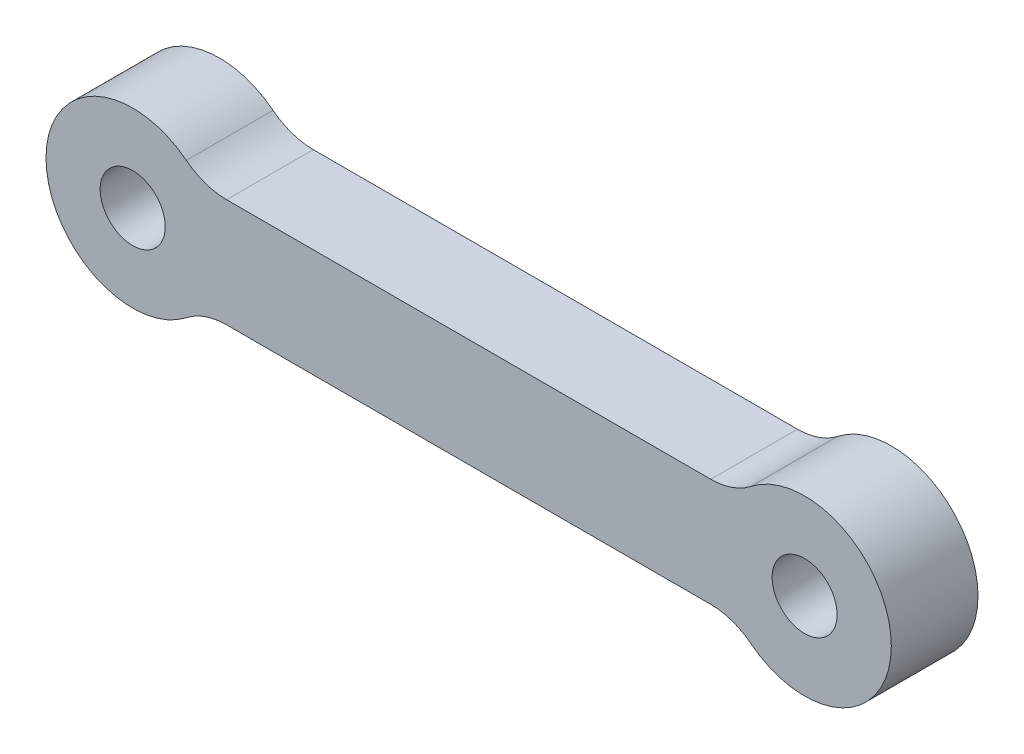
ISO-10303-21;
HEADER;
FILE_DESCRIPTION(('STEP AP214'),'2;1');
FILE_NAME('part.step','',(''),(''),'','','');
FILE_SCHEMA(('AUTOMOTIVE_DESIGN { 1 0 10303 214 1 1 1 1 }'));
ENDSEC;
DATA;
#1=APPLICATION_CONTEXT('core data for automotive mechanical design processes');
#2=APPLICATION_PROTOCOL_DEFINITION('international standard','automotive_design',2000,#1);
#3=PRODUCT_CONTEXT('',#1,'mechanical');
#4=PRODUCT('Part','Part','',(#3));
#5=PRODUCT_RELATED_PRODUCT_CATEGORY('part','',(#4));
#6=PRODUCT_DEFINITION_FORMATION('','',#4);
#7=PRODUCT_DEFINITION_CONTEXT('part definition',#1,'design');
#8=PRODUCT_DEFINITION('design','',#6,#7);
#9=PRODUCT_DEFINITION_SHAPE('','',#8);
#10=(LENGTH_UNIT() NAMED_UNIT(*) SI_UNIT(.MILLI.,.METRE.));
#11=(NAMED_UNIT(*) PLANE_ANGLE_UNIT() SI_UNIT($,.RADIAN.));
#12=(NAMED_UNIT(*) SI_UNIT($,.STERADIAN.) SOLID_ANGLE_UNIT());
#13=UNCERTAINTY_MEASURE_WITH_UNIT(LENGTH_MEASURE(1.E-05),#10,'distance_accuracy_value','');
#14=(GEOMETRIC_REPRESENTATION_CONTEXT(3) GLOBAL_UNCERTAINTY_ASSIGNED_CONTEXT((#13)) GLOBAL_UNIT_ASSIGNED_CONTEXT((#10,
#11,#12)) REPRESENTATION_CONTEXT('',''));
#15=CARTESIAN_POINT('',(0.,0.,0.));
#16=DIRECTION('',(0.,0.,1.));
#17=DIRECTION('',(1.,0.,0.));
#18=AXIS2_PLACEMENT_3D('',#15,#16,#17);
#19=CARTESIAN_POINT('',(11.1698729810778,-5.5,4.));
#20=DIRECTION('',(0.,0.,-1.));
#21=DIRECTION('',(-1.,0.,0.));
#22=AXIS2_PLACEMENT_3D('',#19,#20,#21);
#23=PLANE('',#22);
#24=CARTESIAN_POINT('',(11.1698729810778,-5.5,4.));
#25=DIRECTION('',(0.,0.,-1.));
#26=DIRECTION('',(-1.,0.,0.));
#27=AXIS2_PLACEMENT_3D('',#24,#25,#26);
#28=CIRCLE('',#27,3.);
#29=CARTESIAN_POINT('',(11.1698729810778,-2.5,4.));
#30=VERTEX_POINT('',#29);
#31=CARTESIAN_POINT('',(13.025641703473,-3.14285714285714,4.));
#32=VERTEX_POINT('',#31);
#33=EDGE_CURVE('E155',#30,#32,#28,.T.);
#34=ORIENTED_EDGE('',*,*,#33,.T.);
#35=CARTESIAN_POINT('',(15.5,0.,4.));
#36=DIRECTION('',(0.,0.,1.));
#37=DIRECTION('',(-1.,0.,0.));
#38=AXIS2_PLACEMENT_3D('',#35,#36,#37);
#39=CIRCLE('',#38,4.);
#40=CARTESIAN_POINT('',(13.025641703473,3.14285714285714,4.));
#41=VERTEX_POINT('',#40);
#42=EDGE_CURVE('E104',#32,#41,#39,.T.);
#43=ORIENTED_EDGE('',*,*,#42,.T.);
#44=CARTESIAN_POINT('',(11.1698729810778,5.5,4.));
#45=DIRECTION('',(0.,0.,-1.));
#46=DIRECTION('',(1.,0.,0.));
#47=AXIS2_PLACEMENT_3D('',#44,#45,#46);
#48=CIRCLE('',#47,3.);
#49=CARTESIAN_POINT('',(11.1698729810778,2.5,4.));
#50=VERTEX_POINT('',#49);
#51=EDGE_CURVE('E169',#41,#50,#48,.T.);
#52=ORIENTED_EDGE('',*,*,#51,.T.);
#53=DIRECTION('',(-1.,0.,0.));
#54=VECTOR('',#53,1.);
#55=CARTESIAN_POINT('',(-11.1698729810778,2.5,4.));
#56=LINE('',#55,#54);
#57=CARTESIAN_POINT('',(-11.1698729810778,2.5,4.));
#58=VERTEX_POINT('',#57);
#59=EDGE_CURVE('E183',#50,#58,#56,.T.);
#60=ORIENTED_EDGE('',*,*,#59,.T.);
#61=CARTESIAN_POINT('',(-11.1698729810778,5.5,4.));
#62=DIRECTION('',(0.,0.,-1.));
#63=DIRECTION('',(-1.,0.,0.));
#64=AXIS2_PLACEMENT_3D('',#61,#62,#63);
#65=CIRCLE('',#64,3.);
#66=CARTESIAN_POINT('',(-13.025641703473,3.14285714285714,4.));
#67=VERTEX_POINT('',#66);
#68=EDGE_CURVE('E122',#58,#67,#65,.T.);
#69=ORIENTED_EDGE('',*,*,#68,.T.);
#70=CARTESIAN_POINT('',(-15.5,0.,4.));
#71=DIRECTION('',(0.,0.,1.));
#72=DIRECTION('',(1.,0.,0.));
#73=AXIS2_PLACEMENT_3D('',#70,#71,#72);
#74=CIRCLE('',#73,4.);
#75=CARTESIAN_POINT('',(-13.025641703473,-3.14285714285714,4.));
#76=VERTEX_POINT('',#75);
#77=EDGE_CURVE('E116',#67,#76,#74,.T.);
#78=ORIENTED_EDGE('',*,*,#77,.T.);
#79=CARTESIAN_POINT('',(-11.1698729810778,-5.5,4.));
#80=DIRECTION('',(0.,0.,-1.));
#81=DIRECTION('',(-1.,0.,0.));
#82=AXIS2_PLACEMENT_3D('',#79,#80,#81);
#83=CIRCLE('',#82,3.);
#84=CARTESIAN_POINT('',(-11.1698729810778,-2.5,4.));
#85=VERTEX_POINT('',#84);
#86=EDGE_CURVE('E120',#76,#85,#83,.T.);
#87=ORIENTED_EDGE('',*,*,#86,.T.);
#88=DIRECTION('',(1.,0.,0.));
#89=VECTOR('',#88,1.);
#90=CARTESIAN_POINT('',(-11.1698729810778,-2.5,4.));
#91=LINE('',#90,#89);
#92=EDGE_CURVE('E58',#85,#30,#91,.T.);
#93=ORIENTED_EDGE('',*,*,#92,.T.);
#94=EDGE_LOOP('',(#34,#43,#52,#60,#69,#78,#87,#93));
#95=FACE_BOUND('',#94,.T.);
#96=CARTESIAN_POINT('',(-15.5,0.,4.));
#97=DIRECTION('',(0.,0.,1.));
#98=DIRECTION('',(1.,0.,0.));
#99=AXIS2_PLACEMENT_3D('',#96,#97,#98);
#100=CIRCLE('',#99,1.5);
#101=CARTESIAN_POINT('',(-14.,0.,4.));
#102=VERTEX_POINT('',#101);
#103=EDGE_CURVE('E143',#102,#102,#100,.T.);
#104=ORIENTED_EDGE('',*,*,#103,.F.);
#105=EDGE_LOOP('',(#104));
#106=FACE_BOUND('',#105,.T.);
#107=CARTESIAN_POINT('',(15.5,0.,4.));
#108=DIRECTION('',(0.,0.,1.));
#109=DIRECTION('',(-1.,0.,0.));
#110=AXIS2_PLACEMENT_3D('',#107,#108,#109);
#111=CIRCLE('',#110,1.5);
#112=CARTESIAN_POINT('',(14.,0.,4.));
#113=VERTEX_POINT('',#112);
#114=EDGE_CURVE('E195',#113,#113,#111,.T.);
#115=ORIENTED_EDGE('',*,*,#114,.F.);
#116=EDGE_LOOP('',(#115));
#117=FACE_BOUND('',#116,.T.);
#118=ADVANCED_FACE('F43',(#95,#106,#117),#23,.F.);
#119=CARTESIAN_POINT('',(11.1698729810778,-5.5,0.));
#120=DIRECTION('',(0.,0.,-1.));
#121=DIRECTION('',(-1.,0.,0.));
#122=AXIS2_PLACEMENT_3D('',#119,#120,#121);
#123=PLANE('',#122);
#124=CARTESIAN_POINT('',(-15.5,0.,0.));
#125=DIRECTION('',(0.,0.,1.));
#126=DIRECTION('',(1.,0.,0.));
#127=AXIS2_PLACEMENT_3D('',#124,#125,#126);
#128=CIRCLE('',#127,1.5);
#129=CARTESIAN_POINT('',(-14.,0.,0.));
#130=VERTEX_POINT('',#129);
#131=EDGE_CURVE('E188',#130,#130,#128,.T.);
#132=ORIENTED_EDGE('',*,*,#131,.T.);
#133=EDGE_LOOP('',(#132));
#134=FACE_BOUND('',#133,.T.);
#135=CARTESIAN_POINT('',(11.1698729810778,-5.5,0.));
#136=DIRECTION('',(0.,0.,-1.));
#137=DIRECTION('',(-1.,0.,0.));
#138=AXIS2_PLACEMENT_3D('',#135,#136,#137);
#139=CIRCLE('',#138,3.);
#140=CARTESIAN_POINT('',(11.1698729810778,-2.5,0.));
#141=VERTEX_POINT('',#140);
#142=CARTESIAN_POINT('',(13.025641703473,-3.14285714285714,0.));
#143=VERTEX_POINT('',#142);
#144=EDGE_CURVE('E139',#141,#143,#139,.T.);
#145=ORIENTED_EDGE('',*,*,#144,.F.);
#146=DIRECTION('',(1.,0.,0.));
#147=VECTOR('',#146,1.);
#148=CARTESIAN_POINT('',(-11.1698729810778,-2.5,0.));
#149=LINE('',#148,#147);
#150=CARTESIAN_POINT('',(-11.1698729810778,-2.5,0.));
#151=VERTEX_POINT('',#150);
#152=EDGE_CURVE('E94',#151,#141,#149,.T.);
#153=ORIENTED_EDGE('',*,*,#152,.F.);
#154=CARTESIAN_POINT('',(-11.1698729810778,-5.5,0.));
#155=DIRECTION('',(0.,0.,-1.));
#156=DIRECTION('',(-1.,0.,0.));
#157=AXIS2_PLACEMENT_3D('',#154,#155,#156);
#158=CIRCLE('',#157,3.);
#159=CARTESIAN_POINT('',(-13.025641703473,-3.14285714285714,0.));
#160=VERTEX_POINT('',#159);
#161=EDGE_CURVE('E87',#160,#151,#158,.T.);
#162=ORIENTED_EDGE('',*,*,#161,.F.);
#163=CARTESIAN_POINT('',(-15.5,0.,0.));
#164=DIRECTION('',(0.,0.,1.));
#165=DIRECTION('',(1.,0.,0.));
#166=AXIS2_PLACEMENT_3D('',#163,#164,#165);
#167=CIRCLE('',#166,4.);
#168=CARTESIAN_POINT('',(-13.025641703473,3.14285714285714,0.));
#169=VERTEX_POINT('',#168);
#170=EDGE_CURVE('E127',#169,#160,#167,.T.);
#171=ORIENTED_EDGE('',*,*,#170,.F.);
#172=CARTESIAN_POINT('',(-11.1698729810778,5.5,0.));
#173=DIRECTION('',(0.,0.,-1.));
#174=DIRECTION('',(-1.,0.,0.));
#175=AXIS2_PLACEMENT_3D('',#172,#173,#174);
#176=CIRCLE('',#175,3.);
#177=CARTESIAN_POINT('',(-11.1698729810778,2.5,0.));
#178=VERTEX_POINT('',#177);
#179=EDGE_CURVE('E148',#178,#169,#176,.T.);
#180=ORIENTED_EDGE('',*,*,#179,.F.);
#181=DIRECTION('',(-1.,0.,0.));
#182=VECTOR('',#181,1.);
#183=CARTESIAN_POINT('',(-11.1698729810778,2.5,0.));
#184=LINE('',#183,#182);
#185=CARTESIAN_POINT('',(11.1698729810778,2.5,0.));
#186=VERTEX_POINT('',#185);
#187=EDGE_CURVE('E149',#186,#178,#184,.T.);
#188=ORIENTED_EDGE('',*,*,#187,.F.);
#189=CARTESIAN_POINT('',(11.1698729810778,5.5,0.));
#190=DIRECTION('',(0.,0.,-1.));
#191=DIRECTION('',(1.,0.,0.));
#192=AXIS2_PLACEMENT_3D('',#189,#190,#191);
#193=CIRCLE('',#192,3.);
#194=CARTESIAN_POINT('',(13.025641703473,3.14285714285714,0.));
#195=VERTEX_POINT('',#194);
#196=EDGE_CURVE('E147',#195,#186,#193,.T.);
#197=ORIENTED_EDGE('',*,*,#196,.F.);
#198=CARTESIAN_POINT('',(15.5,0.,0.));
#199=DIRECTION('',(0.,0.,1.));
#200=DIRECTION('',(-1.,0.,0.));
#201=AXIS2_PLACEMENT_3D('',#198,#199,#200);
#202=CIRCLE('',#201,4.);
#203=EDGE_CURVE('E142',#143,#195,#202,.T.);
#204=ORIENTED_EDGE('',*,*,#203,.F.);
#205=EDGE_LOOP('',(#145,#153,#162,#171,#180,#188,#197,#204));
#206=FACE_BOUND('',#205,.T.);
#207=CARTESIAN_POINT('',(15.5,0.,0.));
#208=DIRECTION('',(0.,0.,1.));
#209=DIRECTION('',(-1.,0.,0.));
#210=AXIS2_PLACEMENT_3D('',#207,#208,#209);
#211=CIRCLE('',#210,1.5);
#212=CARTESIAN_POINT('',(14.,0.,0.));
#213=VERTEX_POINT('',#212);
#214=EDGE_CURVE('E193',#213,#213,#211,.T.);
#215=ORIENTED_EDGE('',*,*,#214,.T.);
#216=EDGE_LOOP('',(#215));
#217=FACE_BOUND('',#216,.T.);
#218=ADVANCED_FACE('F174',(#134,#206,#217),#123,.T.);
#219=CARTESIAN_POINT('',(11.1698729810778,-5.5,4.));
#220=DIRECTION('',(0.,0.,-1.));
#221=DIRECTION('',(-1.,0.,0.));
#222=AXIS2_PLACEMENT_3D('',#219,#220,#221);
#223=CYLINDRICAL_SURFACE('',#222,3.);
#224=ORIENTED_EDGE('',*,*,#144,.T.);
#225=DIRECTION('',(0.,0.,-1.));
#226=VECTOR('',#225,1.);
#227=CARTESIAN_POINT('',(13.025641703473,-3.14285714285714,4.));
#228=LINE('',#227,#226);
#229=EDGE_CURVE('E11',#32,#143,#228,.T.);
#230=ORIENTED_EDGE('',*,*,#229,.F.);
#231=ORIENTED_EDGE('',*,*,#33,.F.);
#232=DIRECTION('',(0.,0.,-1.));
#233=VECTOR('',#232,1.);
#234=CARTESIAN_POINT('',(11.1698729810778,-2.5,4.));
#235=LINE('',#234,#233);
#236=EDGE_CURVE('E136',#30,#141,#235,.T.);
#237=ORIENTED_EDGE('',*,*,#236,.T.);
#238=EDGE_LOOP('',(#224,#230,#231,#237));
#239=FACE_BOUND('',#238,.T.);
#240=ADVANCED_FACE('F44',(#239),#223,.F.);
#241=CARTESIAN_POINT('',(15.5,0.,4.));
#242=DIRECTION('',(0.,0.,-1.));
#243=DIRECTION('',(-1.,0.,0.));
#244=AXIS2_PLACEMENT_3D('',#241,#242,#243);
#245=CYLINDRICAL_SURFACE('',#244,4.);
#246=ORIENTED_EDGE('',*,*,#203,.T.);
#247=DIRECTION('',(0.,0.,-1.));
#248=VECTOR('',#247,1.);
#249=CARTESIAN_POINT('',(13.025641703473,3.14285714285714,4.));
#250=LINE('',#249,#248);
#251=EDGE_CURVE('E55',#41,#195,#250,.T.);
#252=ORIENTED_EDGE('',*,*,#251,.F.);
#253=ORIENTED_EDGE('',*,*,#42,.F.);
#254=ORIENTED_EDGE('',*,*,#229,.T.);
#255=EDGE_LOOP('',(#246,#252,#253,#254));
#256=FACE_BOUND('',#255,.T.);
#257=ADVANCED_FACE('F230',(#256),#245,.T.);
#258=CARTESIAN_POINT('',(11.1698729810778,5.5,4.));
#259=DIRECTION('',(0.,0.,-1.));
#260=DIRECTION('',(-1.,0.,0.));
#261=AXIS2_PLACEMENT_3D('',#258,#259,#260);
#262=CYLINDRICAL_SURFACE('',#261,3.);
#263=ORIENTED_EDGE('',*,*,#196,.T.);
#264=DIRECTION('',(0.,0.,-1.));
#265=VECTOR('',#264,1.);
#266=CARTESIAN_POINT('',(11.1698729810778,2.5,4.));
#267=LINE('',#266,#265);
#268=EDGE_CURVE('E162',#50,#186,#267,.T.);
#269=ORIENTED_EDGE('',*,*,#268,.F.);
#270=ORIENTED_EDGE('',*,*,#51,.F.);
#271=ORIENTED_EDGE('',*,*,#251,.T.);
#272=EDGE_LOOP('',(#263,#269,#270,#271));
#273=FACE_BOUND('',#272,.T.);
#274=ADVANCED_FACE('F166',(#273),#262,.F.);
#275=CARTESIAN_POINT('',(-11.1698729810778,2.5,4.));
#276=DIRECTION('',(0.,-1.,0.));
#277=DIRECTION('',(0.,0.,-1.));
#278=AXIS2_PLACEMENT_3D('',#275,#276,#277);
#279=PLANE('',#278);
#280=ORIENTED_EDGE('',*,*,#187,.T.);
#281=DIRECTION('',(0.,0.,-1.));
#282=VECTOR('',#281,1.);
#283=CARTESIAN_POINT('',(-11.1698729810778,2.5,4.));
#284=LINE('',#283,#282);
#285=EDGE_CURVE('E159',#58,#178,#284,.T.);
#286=ORIENTED_EDGE('',*,*,#285,.F.);
#287=ORIENTED_EDGE('',*,*,#59,.F.);
#288=ORIENTED_EDGE('',*,*,#268,.T.);
#289=EDGE_LOOP('',(#280,#286,#287,#288));
#290=FACE_BOUND('',#289,.T.);
#291=ADVANCED_FACE('F177',(#290),#279,.F.);
#292=CARTESIAN_POINT('',(-11.1698729810778,5.5,4.));
#293=DIRECTION('',(0.,0.,-1.));
#294=DIRECTION('',(-1.,0.,0.));
#295=AXIS2_PLACEMENT_3D('',#292,#293,#294);
#296=CYLINDRICAL_SURFACE('',#295,3.);
#297=ORIENTED_EDGE('',*,*,#179,.T.);
#298=DIRECTION('',(0.,0.,-1.));
#299=VECTOR('',#298,1.);
#300=CARTESIAN_POINT('',(-13.025641703473,3.14285714285714,4.));
#301=LINE('',#300,#299);
#302=EDGE_CURVE('E131',#67,#169,#301,.T.);
#303=ORIENTED_EDGE('',*,*,#302,.F.);
#304=ORIENTED_EDGE('',*,*,#68,.F.);
#305=ORIENTED_EDGE('',*,*,#285,.T.);
#306=EDGE_LOOP('',(#297,#303,#304,#305));
#307=FACE_BOUND('',#306,.T.);
#308=ADVANCED_FACE('F185',(#307),#296,.F.);
#309=CARTESIAN_POINT('',(-15.5,0.,4.));
#310=DIRECTION('',(0.,0.,-1.));
#311=DIRECTION('',(-1.,0.,0.));
#312=AXIS2_PLACEMENT_3D('',#309,#310,#311);
#313=CYLINDRICAL_SURFACE('',#312,4.);
#314=ORIENTED_EDGE('',*,*,#170,.T.);
#315=DIRECTION('',(0.,0.,-1.));
#316=VECTOR('',#315,1.);
#317=CARTESIAN_POINT('',(-13.025641703473,-3.14285714285714,4.));
#318=LINE('',#317,#316);
#319=EDGE_CURVE('E130',#76,#160,#318,.T.);
#320=ORIENTED_EDGE('',*,*,#319,.F.);
#321=ORIENTED_EDGE('',*,*,#77,.F.);
#322=ORIENTED_EDGE('',*,*,#302,.T.);
#323=EDGE_LOOP('',(#314,#320,#321,#322));
#324=FACE_BOUND('',#323,.T.);
#325=ADVANCED_FACE('F126',(#324),#313,.T.);
#326=CARTESIAN_POINT('',(-11.1698729810778,-5.5,4.));
#327=DIRECTION('',(0.,0.,-1.));
#328=DIRECTION('',(-1.,0.,0.));
#329=AXIS2_PLACEMENT_3D('',#326,#327,#328);
#330=CYLINDRICAL_SURFACE('',#329,3.);
#331=ORIENTED_EDGE('',*,*,#161,.T.);
#332=DIRECTION('',(0.,0.,-1.));
#333=VECTOR('',#332,1.);
#334=CARTESIAN_POINT('',(-11.1698729810778,-2.5,4.));
#335=LINE('',#334,#333);
#336=EDGE_CURVE('E135',#85,#151,#335,.T.);
#337=ORIENTED_EDGE('',*,*,#336,.F.);
#338=ORIENTED_EDGE('',*,*,#86,.F.);
#339=ORIENTED_EDGE('',*,*,#319,.T.);
#340=EDGE_LOOP('',(#331,#337,#338,#339));
#341=FACE_BOUND('',#340,.T.);
#342=ADVANCED_FACE('F132',(#341),#330,.F.);
#343=CARTESIAN_POINT('',(-11.1698729810778,-2.5,4.));
#344=DIRECTION('',(0.,1.,0.));
#345=DIRECTION('',(0.,0.,1.));
#346=AXIS2_PLACEMENT_3D('',#343,#344,#345);
#347=PLANE('',#346);
#348=ORIENTED_EDGE('',*,*,#152,.T.);
#349=ORIENTED_EDGE('',*,*,#236,.F.);
#350=ORIENTED_EDGE('',*,*,#92,.F.);
#351=ORIENTED_EDGE('',*,*,#336,.T.);
#352=EDGE_LOOP('',(#348,#349,#350,#351));
#353=FACE_BOUND('',#352,.T.);
#354=ADVANCED_FACE('F214',(#353),#347,.F.);
#355=CARTESIAN_POINT('',(-15.5,0.,4.));
#356=DIRECTION('',(0.,0.,-1.));
#357=DIRECTION('',(-1.,0.,0.));
#358=AXIS2_PLACEMENT_3D('',#355,#356,#357);
#359=CYLINDRICAL_SURFACE('',#358,1.5);
#360=ORIENTED_EDGE('',*,*,#103,.T.);
#361=EDGE_LOOP('',(#360));
#362=FACE_BOUND('',#361,.T.);
#363=ORIENTED_EDGE('',*,*,#131,.F.);
#364=EDGE_LOOP('',(#363));
#365=FACE_BOUND('',#364,.T.);
#366=ADVANCED_FACE('F212',(#362,#365),#359,.F.);
#367=CARTESIAN_POINT('',(15.5,0.,4.));
#368=DIRECTION('',(0.,0.,-1.));
#369=DIRECTION('',(-1.,0.,0.));
#370=AXIS2_PLACEMENT_3D('',#367,#368,#369);
#371=CYLINDRICAL_SURFACE('',#370,1.5);
#372=ORIENTED_EDGE('',*,*,#114,.T.);
#373=EDGE_LOOP('',(#372));
#374=FACE_BOUND('',#373,.T.);
#375=ORIENTED_EDGE('',*,*,#214,.F.);
#376=EDGE_LOOP('',(#375));
#377=FACE_BOUND('',#376,.T.);
#378=ADVANCED_FACE('F202',(#374,#377),#371,.F.);
#379=CLOSED_SHELL('',(#118,#218,#240,#257,#274,#291,#308,#325,#342,#354,#366,#378));
#380=MANIFOLD_SOLID_BREP('B2',#379);
#381=ADVANCED_BREP_SHAPE_REPRESENTATION('',(#18,#380),#14);
#382=SHAPE_DEFINITION_REPRESENTATION(#9,#381);
ENDSEC;
END-ISO-10303-21;
